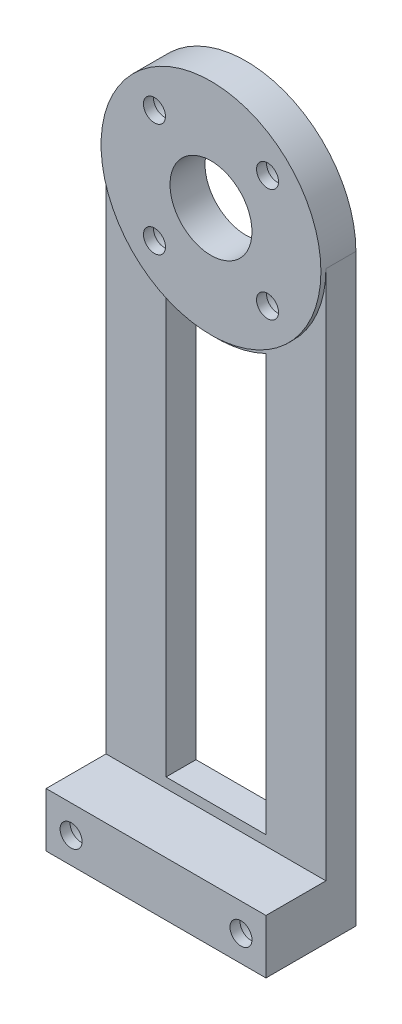
ISO-10303-21;
HEADER;
FILE_DESCRIPTION(('STEP AP214'),'2;1');
FILE_NAME('part.step','',(''),(''),'','','');
FILE_SCHEMA(('AUTOMOTIVE_DESIGN { 1 0 10303 214 1 1 1 1 }'));
ENDSEC;
DATA;
#1=APPLICATION_CONTEXT('core data for automotive mechanical design processes');
#2=APPLICATION_PROTOCOL_DEFINITION('international standard','automotive_design',2000,#1);
#3=PRODUCT_CONTEXT('',#1,'mechanical');
#4=PRODUCT('Part','Part','',(#3));
#5=PRODUCT_RELATED_PRODUCT_CATEGORY('part','',(#4));
#6=PRODUCT_DEFINITION_FORMATION('','',#4);
#7=PRODUCT_DEFINITION_CONTEXT('part definition',#1,'design');
#8=PRODUCT_DEFINITION('design','',#6,#7);
#9=PRODUCT_DEFINITION_SHAPE('','',#8);
#10=(LENGTH_UNIT() NAMED_UNIT(*) SI_UNIT(.MILLI.,.METRE.));
#11=(NAMED_UNIT(*) PLANE_ANGLE_UNIT() SI_UNIT($,.RADIAN.));
#12=(NAMED_UNIT(*) SI_UNIT($,.STERADIAN.) SOLID_ANGLE_UNIT());
#13=UNCERTAINTY_MEASURE_WITH_UNIT(LENGTH_MEASURE(1.E-05),#10,'distance_accuracy_value','');
#14=(GEOMETRIC_REPRESENTATION_CONTEXT(3) GLOBAL_UNCERTAINTY_ASSIGNED_CONTEXT((#13)) GLOBAL_UNIT_ASSIGNED_CONTEXT((#10,
#11,#12)) REPRESENTATION_CONTEXT('',''));
#15=CARTESIAN_POINT('',(0.,0.,0.));
#16=DIRECTION('',(0.,0.,1.));
#17=DIRECTION('',(1.,0.,0.));
#18=AXIS2_PLACEMENT_3D('',#15,#16,#17);
#19=CARTESIAN_POINT('',(8.5,-26.62018786,9.11126983722081));
#20=DIRECTION('',(0.,0.,-1.));
#21=DIRECTION('',(1.,0.,0.));
#22=AXIS2_PLACEMENT_3D('',#19,#20,#21);
#23=CYLINDRICAL_SURFACE('',#22,1.1);
#24=CARTESIAN_POINT('',(8.5,-26.62018786,6.));
#25=DIRECTION('',(0.,0.,1.));
#26=DIRECTION('',(1.,0.,0.));
#27=AXIS2_PLACEMENT_3D('',#24,#25,#26);
#28=CIRCLE('',#27,1.1);
#29=CARTESIAN_POINT('',(9.6,-26.62018786,6.));
#30=VERTEX_POINT('',#29);
#31=EDGE_CURVE('E241',#30,#30,#28,.F.);
#32=ORIENTED_EDGE('',*,*,#31,.F.);
#33=EDGE_LOOP('',(#32));
#34=FACE_BOUND('',#33,.T.);
#35=CARTESIAN_POINT('',(8.5,-26.62018786,5.));
#36=DIRECTION('',(0.,0.,1.));
#37=DIRECTION('',(1.,0.,0.));
#38=AXIS2_PLACEMENT_3D('',#35,#36,#37);
#39=CIRCLE('',#38,1.1);
#40=CARTESIAN_POINT('',(9.6,-26.62018786,5.));
#41=VERTEX_POINT('',#40);
#42=EDGE_CURVE('E639',#41,#41,#39,.F.);
#43=ORIENTED_EDGE('',*,*,#42,.T.);
#44=EDGE_LOOP('',(#43));
#45=FACE_BOUND('',#44,.T.);
#46=ADVANCED_FACE('F67',(#34,#45),#23,.F.);
#47=CARTESIAN_POINT('',(-8.5,-26.62018786,9.11126983722081));
#48=DIRECTION('',(0.,0.,-1.));
#49=DIRECTION('',(1.,0.,0.));
#50=AXIS2_PLACEMENT_3D('',#47,#48,#49);
#51=CYLINDRICAL_SURFACE('',#50,1.1);
#52=CARTESIAN_POINT('',(-8.5,-26.62018786,6.));
#53=DIRECTION('',(0.,0.,1.));
#54=DIRECTION('',(1.,0.,0.));
#55=AXIS2_PLACEMENT_3D('',#52,#53,#54);
#56=CIRCLE('',#55,1.1);
#57=CARTESIAN_POINT('',(-7.4,-26.62018786,6.));
#58=VERTEX_POINT('',#57);
#59=EDGE_CURVE('E238',#58,#58,#56,.F.);
#60=ORIENTED_EDGE('',*,*,#59,.F.);
#61=EDGE_LOOP('',(#60));
#62=FACE_BOUND('',#61,.T.);
#63=CARTESIAN_POINT('',(-8.5,-26.62018786,5.));
#64=DIRECTION('',(0.,0.,1.));
#65=DIRECTION('',(1.,0.,0.));
#66=AXIS2_PLACEMENT_3D('',#63,#64,#65);
#67=CIRCLE('',#66,1.1);
#68=CARTESIAN_POINT('',(-7.4,-26.62018786,5.));
#69=VERTEX_POINT('',#68);
#70=EDGE_CURVE('E650',#69,#69,#67,.F.);
#71=ORIENTED_EDGE('',*,*,#70,.T.);
#72=EDGE_LOOP('',(#71));
#73=FACE_BOUND('',#72,.T.);
#74=ADVANCED_FACE('F326',(#62,#73),#51,.F.);
#75=CARTESIAN_POINT('',(-5.65685424949235,23.5781457505076,12.0965512114594));
#76=DIRECTION('',(0.,0.,-1.));
#77=DIRECTION('',(1.,0.,0.));
#78=AXIS2_PLACEMENT_3D('',#75,#76,#77);
#79=CYLINDRICAL_SURFACE('',#78,1.10000000000001);
#80=CARTESIAN_POINT('',(-5.65685424949235,23.5781457505076,0.5));
#81=DIRECTION('',(0.,0.,1.));
#82=DIRECTION('',(1.,0.,0.));
#83=AXIS2_PLACEMENT_3D('',#80,#81,#82);
#84=CIRCLE('',#83,1.10000000000001);
#85=CARTESIAN_POINT('',(-4.55685424949234,23.5781457505076,0.5));
#86=VERTEX_POINT('',#85);
#87=EDGE_CURVE('E276',#86,#86,#84,.F.);
#88=ORIENTED_EDGE('',*,*,#87,.F.);
#89=EDGE_LOOP('',(#88));
#90=FACE_BOUND('',#89,.T.);
#91=CARTESIAN_POINT('',(-5.65685424949235,23.5781457505076,-0.5));
#92=DIRECTION('',(0.,0.,1.));
#93=DIRECTION('',(1.,0.,0.));
#94=AXIS2_PLACEMENT_3D('',#91,#92,#93);
#95=CIRCLE('',#94,1.10000000000001);
#96=CARTESIAN_POINT('',(-4.55685424949234,23.5781457505076,-0.5));
#97=VERTEX_POINT('',#96);
#98=EDGE_CURVE('E263',#97,#97,#95,.F.);
#99=ORIENTED_EDGE('',*,*,#98,.T.);
#100=EDGE_LOOP('',(#99));
#101=FACE_BOUND('',#100,.T.);
#102=ADVANCED_FACE('F332',(#90,#101),#79,.F.);
#103=CARTESIAN_POINT('',(-5.65685424949244,34.8918542494923,12.0965512114594));
#104=DIRECTION('',(0.,0.,-1.));
#105=DIRECTION('',(1.,0.,0.));
#106=AXIS2_PLACEMENT_3D('',#103,#104,#105);
#107=CYLINDRICAL_SURFACE('',#106,1.10000000000001);
#108=CARTESIAN_POINT('',(-5.65685424949244,34.8918542494923,0.5));
#109=DIRECTION('',(0.,0.,1.));
#110=DIRECTION('',(1.,0.,0.));
#111=AXIS2_PLACEMENT_3D('',#108,#109,#110);
#112=CIRCLE('',#111,1.10000000000001);
#113=CARTESIAN_POINT('',(-4.55685424949243,34.8918542494923,0.5));
#114=VERTEX_POINT('',#113);
#115=EDGE_CURVE('E279',#114,#114,#112,.F.);
#116=ORIENTED_EDGE('',*,*,#115,.F.);
#117=EDGE_LOOP('',(#116));
#118=FACE_BOUND('',#117,.T.);
#119=CARTESIAN_POINT('',(-5.65685424949244,34.8918542494923,-0.5));
#120=DIRECTION('',(0.,0.,1.));
#121=DIRECTION('',(1.,0.,0.));
#122=AXIS2_PLACEMENT_3D('',#119,#120,#121);
#123=CIRCLE('',#122,1.10000000000001);
#124=CARTESIAN_POINT('',(-4.55685424949243,34.8918542494923,-0.5));
#125=VERTEX_POINT('',#124);
#126=EDGE_CURVE('E253',#125,#125,#123,.F.);
#127=ORIENTED_EDGE('',*,*,#126,.T.);
#128=EDGE_LOOP('',(#127));
#129=FACE_BOUND('',#128,.T.);
#130=ADVANCED_FACE('F367',(#118,#129),#107,.F.);
#131=CARTESIAN_POINT('',(5.65685424949247,23.5781457505077,12.0965512114594));
#132=DIRECTION('',(0.,0.,-1.));
#133=DIRECTION('',(1.,0.,0.));
#134=AXIS2_PLACEMENT_3D('',#131,#132,#133);
#135=CYLINDRICAL_SURFACE('',#134,1.10000000000001);
#136=CARTESIAN_POINT('',(5.65685424949247,23.5781457505077,0.5));
#137=DIRECTION('',(0.,0.,1.));
#138=DIRECTION('',(1.,0.,0.));
#139=AXIS2_PLACEMENT_3D('',#136,#137,#138);
#140=CIRCLE('',#139,1.10000000000001);
#141=CARTESIAN_POINT('',(6.75685424949248,23.5781457505077,0.5));
#142=VERTEX_POINT('',#141);
#143=EDGE_CURVE('E259',#142,#142,#140,.F.);
#144=ORIENTED_EDGE('',*,*,#143,.F.);
#145=EDGE_LOOP('',(#144));
#146=FACE_BOUND('',#145,.T.);
#147=CARTESIAN_POINT('',(5.65685424949247,23.5781457505077,-0.5));
#148=DIRECTION('',(0.,0.,1.));
#149=DIRECTION('',(1.,0.,0.));
#150=AXIS2_PLACEMENT_3D('',#147,#148,#149);
#151=CIRCLE('',#150,1.10000000000001);
#152=CARTESIAN_POINT('',(6.75685424949248,23.5781457505077,-0.5));
#153=VERTEX_POINT('',#152);
#154=EDGE_CURVE('E247',#153,#153,#151,.F.);
#155=ORIENTED_EDGE('',*,*,#154,.T.);
#156=EDGE_LOOP('',(#155));
#157=FACE_BOUND('',#156,.T.);
#158=ADVANCED_FACE('F304',(#146,#157),#135,.F.);
#159=CARTESIAN_POINT('',(5.65685424949235,34.8918542494924,12.0965512114594));
#160=DIRECTION('',(0.,0.,-1.));
#161=DIRECTION('',(1.,0.,0.));
#162=AXIS2_PLACEMENT_3D('',#159,#160,#161);
#163=CYLINDRICAL_SURFACE('',#162,1.10000000000001);
#164=CARTESIAN_POINT('',(5.65685424949235,34.8918542494924,0.5));
#165=DIRECTION('',(0.,0.,1.));
#166=DIRECTION('',(1.,0.,0.));
#167=AXIS2_PLACEMENT_3D('',#164,#165,#166);
#168=CIRCLE('',#167,1.10000000000001);
#169=CARTESIAN_POINT('',(6.75685424949236,34.8918542494924,0.5));
#170=VERTEX_POINT('',#169);
#171=EDGE_CURVE('E182',#170,#170,#168,.F.);
#172=ORIENTED_EDGE('',*,*,#171,.F.);
#173=EDGE_LOOP('',(#172));
#174=FACE_BOUND('',#173,.T.);
#175=CARTESIAN_POINT('',(5.65685424949235,34.8918542494924,-0.5));
#176=DIRECTION('',(0.,0.,1.));
#177=DIRECTION('',(1.,0.,0.));
#178=AXIS2_PLACEMENT_3D('',#175,#176,#177);
#179=CIRCLE('',#178,1.10000000000001);
#180=CARTESIAN_POINT('',(6.75685424949236,34.8918542494924,-0.5));
#181=VERTEX_POINT('',#180);
#182=EDGE_CURVE('E282',#181,#181,#179,.F.);
#183=ORIENTED_EDGE('',*,*,#182,.T.);
#184=EDGE_LOOP('',(#183));
#185=FACE_BOUND('',#184,.T.);
#186=ADVANCED_FACE('F301',(#174,#185),#163,.F.);
#187=CARTESIAN_POINT('',(0.,0.,0.));
#188=DIRECTION('',(0.,0.,-1.));
#189=DIRECTION('',(1.,0.,0.));
#190=AXIS2_PLACEMENT_3D('',#187,#188,#189);
#191=PLANE('',#190);
#192=DIRECTION('',(0.,-1.,0.));
#193=VECTOR('',#192,1.);
#194=CARTESIAN_POINT('',(11.,0.,0.));
#195=LINE('',#194,#193);
#196=CARTESIAN_POINT('',(11.,29.235,0.));
#197=VERTEX_POINT('',#196);
#198=CARTESIAN_POINT('',(11.,-23.815,0.));
#199=VERTEX_POINT('',#198);
#200=EDGE_CURVE('E169',#197,#199,#195,.T.);
#201=ORIENTED_EDGE('',*,*,#200,.F.);
#202=CARTESIAN_POINT('',(0.,29.235,0.));
#203=DIRECTION('',(0.,0.,1.));
#204=DIRECTION('',(1.,0.,0.));
#205=AXIS2_PLACEMENT_3D('',#202,#203,#204);
#206=CIRCLE('',#205,11.);
#207=CARTESIAN_POINT('',(-11.,29.235,0.));
#208=VERTEX_POINT('',#207);
#209=EDGE_CURVE('E13',#208,#197,#206,.T.);
#210=ORIENTED_EDGE('',*,*,#209,.F.);
#211=DIRECTION('',(0.,-1.,0.));
#212=VECTOR('',#211,1.);
#213=CARTESIAN_POINT('',(-11.,0.,0.));
#214=LINE('',#213,#212);
#215=CARTESIAN_POINT('',(-11.,-23.815,0.));
#216=VERTEX_POINT('',#215);
#217=EDGE_CURVE('E171',#208,#216,#214,.T.);
#218=ORIENTED_EDGE('',*,*,#217,.T.);
#219=DIRECTION('',(-1.,0.,0.));
#220=VECTOR('',#219,1.);
#221=CARTESIAN_POINT('',(0.,-23.815,0.));
#222=LINE('',#221,#220);
#223=EDGE_CURVE('E164',#199,#216,#222,.T.);
#224=ORIENTED_EDGE('',*,*,#223,.F.);
#225=EDGE_LOOP('',(#201,#210,#218,#224));
#226=FACE_BOUND('',#225,.T.);
#227=CARTESIAN_POINT('',(0.,29.235,0.));
#228=DIRECTION('',(0.,0.,1.));
#229=DIRECTION('',(1.,0.,0.));
#230=AXIS2_PLACEMENT_3D('',#227,#228,#229);
#231=CIRCLE('',#230,11.5);
#232=CARTESIAN_POINT('',(-5.,18.878842411396,0.));
#233=VERTEX_POINT('',#232);
#234=CARTESIAN_POINT('',(4.99999999999999,18.878842411396,0.));
#235=VERTEX_POINT('',#234);
#236=EDGE_CURVE('E207',#233,#235,#231,.T.);
#237=ORIENTED_EDGE('',*,*,#236,.T.);
#238=DIRECTION('',(0.,-1.,0.));
#239=VECTOR('',#238,1.);
#240=CARTESIAN_POINT('',(5.,0.,0.));
#241=LINE('',#240,#239);
#242=CARTESIAN_POINT('',(5.00000000000002,-22.815,0.));
#243=VERTEX_POINT('',#242);
#244=EDGE_CURVE('E210',#235,#243,#241,.T.);
#245=ORIENTED_EDGE('',*,*,#244,.T.);
#246=DIRECTION('',(1.,0.,0.));
#247=VECTOR('',#246,1.);
#248=CARTESIAN_POINT('',(0.,-22.815,0.));
#249=LINE('',#248,#247);
#250=CARTESIAN_POINT('',(-4.99999999999998,-22.815,0.));
#251=VERTEX_POINT('',#250);
#252=EDGE_CURVE('E213',#251,#243,#249,.T.);
#253=ORIENTED_EDGE('',*,*,#252,.F.);
#254=DIRECTION('',(0.,-1.,0.));
#255=VECTOR('',#254,1.);
#256=CARTESIAN_POINT('',(-4.99999999999999,0.,0.));
#257=LINE('',#256,#255);
#258=EDGE_CURVE('E187',#233,#251,#257,.T.);
#259=ORIENTED_EDGE('',*,*,#258,.F.);
#260=EDGE_LOOP('',(#237,#245,#253,#259));
#261=FACE_BOUND('',#260,.T.);
#262=ADVANCED_FACE('F236',(#226,#261),#191,.F.);
#263=CARTESIAN_POINT('',(0.,-29.235,-3.));
#264=DIRECTION('',(0.,1.,0.));
#265=DIRECTION('',(0.,0.,-1.));
#266=AXIS2_PLACEMENT_3D('',#263,#264,#265);
#267=PLANE('',#266);
#268=DIRECTION('',(0.,0.,1.));
#269=VECTOR('',#268,1.);
#270=CARTESIAN_POINT('',(-11.,-29.235,-3.));
#271=LINE('',#270,#269);
#272=CARTESIAN_POINT('',(-11.,-29.235,-3.));
#273=VERTEX_POINT('',#272);
#274=CARTESIAN_POINT('',(-11.,-29.235,6.));
#275=VERTEX_POINT('',#274);
#276=EDGE_CURVE('E203',#273,#275,#271,.T.);
#277=ORIENTED_EDGE('',*,*,#276,.F.);
#278=DIRECTION('',(1.,0.,0.));
#279=VECTOR('',#278,1.);
#280=CARTESIAN_POINT('',(0.,-29.235,-3.));
#281=LINE('',#280,#279);
#282=CARTESIAN_POINT('',(11.,-29.235,-3.));
#283=VERTEX_POINT('',#282);
#284=EDGE_CURVE('E168',#273,#283,#281,.T.);
#285=ORIENTED_EDGE('',*,*,#284,.T.);
#286=DIRECTION('',(0.,0.,1.));
#287=VECTOR('',#286,1.);
#288=CARTESIAN_POINT('',(11.,-29.235,-3.));
#289=LINE('',#288,#287);
#290=CARTESIAN_POINT('',(11.,-29.235,6.));
#291=VERTEX_POINT('',#290);
#292=EDGE_CURVE('E71',#283,#291,#289,.T.);
#293=ORIENTED_EDGE('',*,*,#292,.T.);
#294=DIRECTION('',(1.,0.,0.));
#295=VECTOR('',#294,1.);
#296=CARTESIAN_POINT('',(0.,-29.235,6.));
#297=LINE('',#296,#295);
#298=EDGE_CURVE('E156',#275,#291,#297,.T.);
#299=ORIENTED_EDGE('',*,*,#298,.F.);
#300=EDGE_LOOP('',(#277,#285,#293,#299));
#301=FACE_BOUND('',#300,.T.);
#302=ADVANCED_FACE('F166',(#301),#267,.F.);
#303=CARTESIAN_POINT('',(-11.,0.,-3.));
#304=DIRECTION('',(1.,0.,0.));
#305=DIRECTION('',(0.,1.,0.));
#306=AXIS2_PLACEMENT_3D('',#303,#304,#305);
#307=PLANE('',#306);
#308=ORIENTED_EDGE('',*,*,#276,.T.);
#309=DIRECTION('',(0.,-1.,0.));
#310=VECTOR('',#309,1.);
#311=CARTESIAN_POINT('',(-11.,0.,6.));
#312=LINE('',#311,#310);
#313=CARTESIAN_POINT('',(-11.,-23.815,6.));
#314=VERTEX_POINT('',#313);
#315=EDGE_CURVE('E160',#314,#275,#312,.T.);
#316=ORIENTED_EDGE('',*,*,#315,.F.);
#317=DIRECTION('',(0.,0.,-1.));
#318=VECTOR('',#317,1.);
#319=CARTESIAN_POINT('',(-11.,-23.815,6.));
#320=LINE('',#319,#318);
#321=EDGE_CURVE('E84',#314,#216,#320,.T.);
#322=ORIENTED_EDGE('',*,*,#321,.T.);
#323=ORIENTED_EDGE('',*,*,#217,.F.);
#324=DIRECTION('',(0.,0.,1.));
#325=VECTOR('',#324,1.);
#326=CARTESIAN_POINT('',(-11.,29.235,-3.));
#327=LINE('',#326,#325);
#328=CARTESIAN_POINT('',(-11.,29.235,-3.));
#329=VERTEX_POINT('',#328);
#330=EDGE_CURVE('E227',#329,#208,#327,.T.);
#331=ORIENTED_EDGE('',*,*,#330,.F.);
#332=DIRECTION('',(0.,-1.,0.));
#333=VECTOR('',#332,1.);
#334=CARTESIAN_POINT('',(-11.,0.,-3.));
#335=LINE('',#334,#333);
#336=EDGE_CURVE('E189',#329,#273,#335,.T.);
#337=ORIENTED_EDGE('',*,*,#336,.T.);
#338=EDGE_LOOP('',(#308,#316,#322,#323,#331,#337));
#339=FACE_BOUND('',#338,.T.);
#340=ADVANCED_FACE('F399',(#339),#307,.F.);
#341=CARTESIAN_POINT('',(0.,0.,-3.));
#342=DIRECTION('',(0.,0.,-1.));
#343=DIRECTION('',(1.,0.,0.));
#344=AXIS2_PLACEMENT_3D('',#341,#342,#343);
#345=PLANE('',#344);
#346=CARTESIAN_POINT('',(-8.5,-26.62018786,-3.));
#347=DIRECTION('',(0.,0.,1.));
#348=DIRECTION('',(1.,0.,0.));
#349=AXIS2_PLACEMENT_3D('',#346,#347,#348);
#350=CIRCLE('',#349,2.);
#351=CARTESIAN_POINT('',(-6.5,-26.62018786,-3.));
#352=VERTEX_POINT('',#351);
#353=EDGE_CURVE('E640',#352,#352,#350,.T.);
#354=ORIENTED_EDGE('',*,*,#353,.T.);
#355=EDGE_LOOP('',(#354));
#356=FACE_BOUND('',#355,.T.);
#357=CARTESIAN_POINT('',(8.5,-26.62018786,-3.));
#358=DIRECTION('',(0.,0.,1.));
#359=DIRECTION('',(1.,0.,0.));
#360=AXIS2_PLACEMENT_3D('',#357,#358,#359);
#361=CIRCLE('',#360,2.);
#362=CARTESIAN_POINT('',(10.5,-26.62018786,-3.));
#363=VERTEX_POINT('',#362);
#364=EDGE_CURVE('E645',#363,#363,#361,.T.);
#365=ORIENTED_EDGE('',*,*,#364,.T.);
#366=EDGE_LOOP('',(#365));
#367=FACE_BOUND('',#366,.T.);
#368=CARTESIAN_POINT('',(-5.65685424949244,34.8918542494923,-3.));
#369=DIRECTION('',(0.,0.,1.));
#370=DIRECTION('',(0.,1.,0.));
#371=AXIS2_PLACEMENT_3D('',#368,#369,#370);
#372=CIRCLE('',#371,2.00000000000001);
#373=CARTESIAN_POINT('',(-5.65685424949244,36.8918542494923,-3.));
#374=VERTEX_POINT('',#373);
#375=EDGE_CURVE('E249',#374,#374,#372,.T.);
#376=ORIENTED_EDGE('',*,*,#375,.T.);
#377=EDGE_LOOP('',(#376));
#378=FACE_BOUND('',#377,.T.);
#379=CARTESIAN_POINT('',(-5.65685424949235,23.5781457505076,-3.));
#380=DIRECTION('',(0.,0.,1.));
#381=DIRECTION('',(-1.,0.,0.));
#382=AXIS2_PLACEMENT_3D('',#379,#380,#381);
#383=CIRCLE('',#382,2.00000000000001);
#384=CARTESIAN_POINT('',(-7.65685424949236,23.5781457505076,-3.));
#385=VERTEX_POINT('',#384);
#386=EDGE_CURVE('E260',#385,#385,#383,.T.);
#387=ORIENTED_EDGE('',*,*,#386,.T.);
#388=EDGE_LOOP('',(#387));
#389=FACE_BOUND('',#388,.T.);
#390=CARTESIAN_POINT('',(5.65685424949247,23.5781457505077,-3.));
#391=DIRECTION('',(0.,0.,1.));
#392=DIRECTION('',(0.,-1.,0.));
#393=AXIS2_PLACEMENT_3D('',#390,#391,#392);
#394=CIRCLE('',#393,2.00000000000001);
#395=CARTESIAN_POINT('',(5.65685424949249,21.5781457505077,-3.));
#396=VERTEX_POINT('',#395);
#397=EDGE_CURVE('E269',#396,#396,#394,.T.);
#398=ORIENTED_EDGE('',*,*,#397,.T.);
#399=EDGE_LOOP('',(#398));
#400=FACE_BOUND('',#399,.T.);
#401=CARTESIAN_POINT('',(5.65685424949235,34.8918542494924,-3.));
#402=DIRECTION('',(0.,0.,1.));
#403=DIRECTION('',(1.,0.,0.));
#404=AXIS2_PLACEMENT_3D('',#401,#402,#403);
#405=CIRCLE('',#404,2.00000000000001);
#406=CARTESIAN_POINT('',(7.65685424949235,34.8918542494924,-3.));
#407=VERTEX_POINT('',#406);
#408=EDGE_CURVE('E285',#407,#407,#405,.T.);
#409=ORIENTED_EDGE('',*,*,#408,.T.);
#410=EDGE_LOOP('',(#409));
#411=FACE_BOUND('',#410,.T.);
#412=CARTESIAN_POINT('',(0.,29.235,-3.));
#413=DIRECTION('',(0.,0.,1.));
#414=DIRECTION('',(1.,0.,0.));
#415=AXIS2_PLACEMENT_3D('',#412,#413,#414);
#416=CIRCLE('',#415,4.1);
#417=CARTESIAN_POINT('',(4.1,29.235,-3.));
#418=VERTEX_POINT('',#417);
#419=EDGE_CURVE('E179',#418,#418,#416,.T.);
#420=ORIENTED_EDGE('',*,*,#419,.T.);
#421=EDGE_LOOP('',(#420));
#422=FACE_BOUND('',#421,.T.);
#423=ORIENTED_EDGE('',*,*,#284,.F.);
#424=ORIENTED_EDGE('',*,*,#336,.F.);
#425=CARTESIAN_POINT('',(0.,29.235,-3.));
#426=DIRECTION('',(0.,0.,1.));
#427=DIRECTION('',(1.,0.,0.));
#428=AXIS2_PLACEMENT_3D('',#425,#426,#427);
#429=CIRCLE('',#428,11.);
#430=CARTESIAN_POINT('',(11.,29.235,-3.));
#431=VERTEX_POINT('',#430);
#432=EDGE_CURVE('E186',#431,#329,#429,.T.);
#433=ORIENTED_EDGE('',*,*,#432,.F.);
#434=DIRECTION('',(0.,-1.,0.));
#435=VECTOR('',#434,1.);
#436=CARTESIAN_POINT('',(11.,0.,-3.));
#437=LINE('',#436,#435);
#438=EDGE_CURVE('E184',#431,#283,#437,.T.);
#439=ORIENTED_EDGE('',*,*,#438,.T.);
#440=EDGE_LOOP('',(#423,#424,#433,#439));
#441=FACE_BOUND('',#440,.T.);
#442=CARTESIAN_POINT('',(0.,29.235,-3.));
#443=DIRECTION('',(0.,0.,1.));
#444=DIRECTION('',(1.,0.,0.));
#445=AXIS2_PLACEMENT_3D('',#442,#443,#444);
#446=CIRCLE('',#445,11.5);
#447=CARTESIAN_POINT('',(-5.,18.878842411396,-3.));
#448=VERTEX_POINT('',#447);
#449=CARTESIAN_POINT('',(4.99999999999999,18.878842411396,-3.));
#450=VERTEX_POINT('',#449);
#451=EDGE_CURVE('E192',#448,#450,#446,.T.);
#452=ORIENTED_EDGE('',*,*,#451,.F.);
#453=DIRECTION('',(0.,-1.,0.));
#454=VECTOR('',#453,1.);
#455=CARTESIAN_POINT('',(-4.99999999999999,0.,-3.));
#456=LINE('',#455,#454);
#457=CARTESIAN_POINT('',(-4.99999999999998,-22.815,-3.));
#458=VERTEX_POINT('',#457);
#459=EDGE_CURVE('E201',#448,#458,#456,.T.);
#460=ORIENTED_EDGE('',*,*,#459,.T.);
#461=DIRECTION('',(1.,0.,0.));
#462=VECTOR('',#461,1.);
#463=CARTESIAN_POINT('',(0.,-22.815,-3.));
#464=LINE('',#463,#462);
#465=CARTESIAN_POINT('',(5.00000000000002,-22.815,-3.));
#466=VERTEX_POINT('',#465);
#467=EDGE_CURVE('E198',#458,#466,#464,.T.);
#468=ORIENTED_EDGE('',*,*,#467,.T.);
#469=DIRECTION('',(0.,-1.,0.));
#470=VECTOR('',#469,1.);
#471=CARTESIAN_POINT('',(5.,0.,-3.));
#472=LINE('',#471,#470);
#473=EDGE_CURVE('E195',#450,#466,#472,.T.);
#474=ORIENTED_EDGE('',*,*,#473,.F.);
#475=EDGE_LOOP('',(#452,#460,#468,#474));
#476=FACE_BOUND('',#475,.T.);
#477=ADVANCED_FACE('F396',(#356,#367,#378,#389,#400,#411,#422,#441,#476),#345,.T.);
#478=CARTESIAN_POINT('',(11.,0.,-3.));
#479=DIRECTION('',(1.,0.,0.));
#480=DIRECTION('',(0.,1.,0.));
#481=AXIS2_PLACEMENT_3D('',#478,#479,#480);
#482=PLANE('',#481);
#483=ORIENTED_EDGE('',*,*,#200,.T.);
#484=DIRECTION('',(0.,0.,-1.));
#485=VECTOR('',#484,1.);
#486=CARTESIAN_POINT('',(11.,-23.815,6.));
#487=LINE('',#486,#485);
#488=CARTESIAN_POINT('',(11.,-23.815,6.));
#489=VERTEX_POINT('',#488);
#490=EDGE_CURVE('E91',#489,#199,#487,.T.);
#491=ORIENTED_EDGE('',*,*,#490,.F.);
#492=DIRECTION('',(0.,-1.,0.));
#493=VECTOR('',#492,1.);
#494=CARTESIAN_POINT('',(11.,0.,6.));
#495=LINE('',#494,#493);
#496=EDGE_CURVE('E148',#489,#291,#495,.T.);
#497=ORIENTED_EDGE('',*,*,#496,.T.);
#498=ORIENTED_EDGE('',*,*,#292,.F.);
#499=ORIENTED_EDGE('',*,*,#438,.F.);
#500=DIRECTION('',(0.,0.,1.));
#501=VECTOR('',#500,1.);
#502=CARTESIAN_POINT('',(11.,29.235,-3.));
#503=LINE('',#502,#501);
#504=EDGE_CURVE('E221',#431,#197,#503,.T.);
#505=ORIENTED_EDGE('',*,*,#504,.T.);
#506=EDGE_LOOP('',(#483,#491,#497,#498,#499,#505));
#507=FACE_BOUND('',#506,.T.);
#508=ADVANCED_FACE('F69',(#507),#482,.T.);
#509=CARTESIAN_POINT('',(0.,29.235,-3.));
#510=DIRECTION('',(0.,0.,1.));
#511=DIRECTION('',(-1.,0.,0.));
#512=AXIS2_PLACEMENT_3D('',#509,#510,#511);
#513=CYLINDRICAL_SURFACE('',#512,11.);
#514=ORIENTED_EDGE('',*,*,#504,.F.);
#515=ORIENTED_EDGE('',*,*,#432,.T.);
#516=ORIENTED_EDGE('',*,*,#330,.T.);
#517=ORIENTED_EDGE('',*,*,#209,.T.);
#518=EDGE_LOOP('',(#514,#515,#516,#517));
#519=FACE_BOUND('',#518,.T.);
#520=CARTESIAN_POINT('',(0.,29.235,0.5));
#521=DIRECTION('',(0.,0.,1.));
#522=DIRECTION('',(1.,0.,0.));
#523=AXIS2_PLACEMENT_3D('',#520,#521,#522);
#524=CIRCLE('',#523,11.);
#525=CARTESIAN_POINT('',(11.,29.235,0.5));
#526=VERTEX_POINT('',#525);
#527=EDGE_CURVE('E170',#526,#526,#524,.T.);
#528=ORIENTED_EDGE('',*,*,#527,.F.);
#529=EDGE_LOOP('',(#528));
#530=FACE_BOUND('',#529,.T.);
#531=ADVANCED_FACE('F232',(#519,#530),#513,.T.);
#532=CARTESIAN_POINT('',(5.,0.,-3.));
#533=DIRECTION('',(1.,0.,0.));
#534=DIRECTION('',(0.,1.,0.));
#535=AXIS2_PLACEMENT_3D('',#532,#533,#534);
#536=PLANE('',#535);
#537=ORIENTED_EDGE('',*,*,#244,.F.);
#538=DIRECTION('',(0.,0.,1.));
#539=VECTOR('',#538,1.);
#540=CARTESIAN_POINT('',(4.99999999999999,18.878842411396,-3.));
#541=LINE('',#540,#539);
#542=EDGE_CURVE('E76',#450,#235,#541,.T.);
#543=ORIENTED_EDGE('',*,*,#542,.F.);
#544=ORIENTED_EDGE('',*,*,#473,.T.);
#545=DIRECTION('',(0.,0.,1.));
#546=VECTOR('',#545,1.);
#547=CARTESIAN_POINT('',(5.00000000000002,-22.815,-3.));
#548=LINE('',#547,#546);
#549=EDGE_CURVE('E223',#466,#243,#548,.T.);
#550=ORIENTED_EDGE('',*,*,#549,.T.);
#551=EDGE_LOOP('',(#537,#543,#544,#550));
#552=FACE_BOUND('',#551,.T.);
#553=ADVANCED_FACE('F410',(#552),#536,.F.);
#554=CARTESIAN_POINT('',(0.,-22.815,-3.));
#555=DIRECTION('',(0.,1.,0.));
#556=DIRECTION('',(0.,0.,-1.));
#557=AXIS2_PLACEMENT_3D('',#554,#555,#556);
#558=PLANE('',#557);
#559=ORIENTED_EDGE('',*,*,#252,.T.);
#560=ORIENTED_EDGE('',*,*,#549,.F.);
#561=ORIENTED_EDGE('',*,*,#467,.F.);
#562=DIRECTION('',(0.,0.,1.));
#563=VECTOR('',#562,1.);
#564=CARTESIAN_POINT('',(-4.99999999999998,-22.815,-3.));
#565=LINE('',#564,#563);
#566=EDGE_CURVE('E220',#458,#251,#565,.T.);
#567=ORIENTED_EDGE('',*,*,#566,.T.);
#568=EDGE_LOOP('',(#559,#560,#561,#567));
#569=FACE_BOUND('',#568,.T.);
#570=ADVANCED_FACE('F406',(#569),#558,.T.);
#571=CARTESIAN_POINT('',(-4.99999999999999,0.,-3.));
#572=DIRECTION('',(1.,0.,0.));
#573=DIRECTION('',(0.,1.,0.));
#574=AXIS2_PLACEMENT_3D('',#571,#572,#573);
#575=PLANE('',#574);
#576=ORIENTED_EDGE('',*,*,#258,.T.);
#577=ORIENTED_EDGE('',*,*,#566,.F.);
#578=ORIENTED_EDGE('',*,*,#459,.F.);
#579=DIRECTION('',(0.,0.,1.));
#580=VECTOR('',#579,1.);
#581=CARTESIAN_POINT('',(-5.,18.878842411396,-3.));
#582=LINE('',#581,#580);
#583=EDGE_CURVE('E218',#448,#233,#582,.T.);
#584=ORIENTED_EDGE('',*,*,#583,.T.);
#585=EDGE_LOOP('',(#576,#577,#578,#584));
#586=FACE_BOUND('',#585,.T.);
#587=ADVANCED_FACE('F403',(#586),#575,.T.);
#588=CARTESIAN_POINT('',(0.,29.235,-3.));
#589=DIRECTION('',(0.,0.,1.));
#590=DIRECTION('',(-1.,0.,0.));
#591=AXIS2_PLACEMENT_3D('',#588,#589,#590);
#592=CYLINDRICAL_SURFACE('',#591,11.5);
#593=ORIENTED_EDGE('',*,*,#236,.F.);
#594=ORIENTED_EDGE('',*,*,#583,.F.);
#595=ORIENTED_EDGE('',*,*,#451,.T.);
#596=ORIENTED_EDGE('',*,*,#542,.T.);
#597=EDGE_LOOP('',(#593,#594,#595,#596));
#598=FACE_BOUND('',#597,.T.);
#599=ADVANCED_FACE('F383',(#598),#592,.T.);
#600=CARTESIAN_POINT('',(0.,0.,0.5));
#601=DIRECTION('',(0.,0.,-1.));
#602=DIRECTION('',(1.,0.,0.));
#603=AXIS2_PLACEMENT_3D('',#600,#601,#602);
#604=PLANE('',#603);
#605=ORIENTED_EDGE('',*,*,#143,.T.);
#606=EDGE_LOOP('',(#605));
#607=FACE_BOUND('',#606,.T.);
#608=ORIENTED_EDGE('',*,*,#115,.T.);
#609=EDGE_LOOP('',(#608));
#610=FACE_BOUND('',#609,.T.);
#611=ORIENTED_EDGE('',*,*,#87,.T.);
#612=EDGE_LOOP('',(#611));
#613=FACE_BOUND('',#612,.T.);
#614=CARTESIAN_POINT('',(0.,29.235,0.5));
#615=DIRECTION('',(0.,0.,1.));
#616=DIRECTION('',(1.,0.,0.));
#617=AXIS2_PLACEMENT_3D('',#614,#615,#616);
#618=CIRCLE('',#617,4.1);
#619=CARTESIAN_POINT('',(4.1,29.235,0.5));
#620=VERTEX_POINT('',#619);
#621=EDGE_CURVE('E174',#620,#620,#618,.F.);
#622=ORIENTED_EDGE('',*,*,#621,.T.);
#623=EDGE_LOOP('',(#622));
#624=FACE_BOUND('',#623,.T.);
#625=ORIENTED_EDGE('',*,*,#171,.T.);
#626=EDGE_LOOP('',(#625));
#627=FACE_BOUND('',#626,.T.);
#628=ORIENTED_EDGE('',*,*,#527,.T.);
#629=EDGE_LOOP('',(#628));
#630=FACE_BOUND('',#629,.T.);
#631=ADVANCED_FACE('F299',(#607,#610,#613,#624,#627,#630),#604,.F.);
#632=CARTESIAN_POINT('',(0.,29.235,12.0965512114594));
#633=DIRECTION('',(0.,0.,-1.));
#634=DIRECTION('',(1.,0.,0.));
#635=AXIS2_PLACEMENT_3D('',#632,#633,#634);
#636=CYLINDRICAL_SURFACE('',#635,4.1);
#637=ORIENTED_EDGE('',*,*,#621,.F.);
#638=EDGE_LOOP('',(#637));
#639=FACE_BOUND('',#638,.T.);
#640=ORIENTED_EDGE('',*,*,#419,.F.);
#641=EDGE_LOOP('',(#640));
#642=FACE_BOUND('',#641,.T.);
#643=ADVANCED_FACE('F321',(#639,#642),#636,.F.);
#644=CARTESIAN_POINT('',(5.65685424949235,34.8918542494924,6.1568542494924));
#645=DIRECTION('',(0.,0.,-1.));
#646=DIRECTION('',(1.,0.,0.));
#647=AXIS2_PLACEMENT_3D('',#644,#645,#646);
#648=CYLINDRICAL_SURFACE('',#647,2.00000000000001);
#649=CARTESIAN_POINT('',(5.65685424949235,34.8918542494924,-0.5));
#650=DIRECTION('',(0.,0.,1.));
#651=DIRECTION('',(1.,0.,0.));
#652=AXIS2_PLACEMENT_3D('',#649,#650,#651);
#653=CIRCLE('',#652,2.00000000000001);
#654=CARTESIAN_POINT('',(7.65685424949235,34.8918542494924,-0.5));
#655=VERTEX_POINT('',#654);
#656=EDGE_CURVE('E288',#655,#655,#653,.F.);
#657=ORIENTED_EDGE('',*,*,#656,.F.);
#658=EDGE_LOOP('',(#657));
#659=FACE_BOUND('',#658,.T.);
#660=ORIENTED_EDGE('',*,*,#408,.F.);
#661=EDGE_LOOP('',(#660));
#662=FACE_BOUND('',#661,.T.);
#663=ADVANCED_FACE('F311',(#659,#662),#648,.F.);
#664=CARTESIAN_POINT('',(0.,0.,-0.5));
#665=DIRECTION('',(0.,0.,-1.));
#666=DIRECTION('',(1.,0.,0.));
#667=AXIS2_PLACEMENT_3D('',#664,#665,#666);
#668=PLANE('',#667);
#669=ORIENTED_EDGE('',*,*,#656,.T.);
#670=EDGE_LOOP('',(#669));
#671=FACE_BOUND('',#670,.T.);
#672=ORIENTED_EDGE('',*,*,#182,.F.);
#673=EDGE_LOOP('',(#672));
#674=FACE_BOUND('',#673,.T.);
#675=ADVANCED_FACE('F308',(#671,#674),#668,.T.);
#676=CARTESIAN_POINT('',(5.65685424949247,23.5781457505077,6.1568542494924));
#677=DIRECTION('',(0.,0.,-1.));
#678=DIRECTION('',(1.,0.,0.));
#679=AXIS2_PLACEMENT_3D('',#676,#677,#678);
#680=CYLINDRICAL_SURFACE('',#679,2.00000000000001);
#681=CARTESIAN_POINT('',(5.65685424949247,23.5781457505077,-0.5));
#682=DIRECTION('',(0.,0.,1.));
#683=DIRECTION('',(1.,0.,0.));
#684=AXIS2_PLACEMENT_3D('',#681,#682,#683);
#685=CIRCLE('',#684,2.00000000000001);
#686=CARTESIAN_POINT('',(7.65685424949248,23.5781457505077,-0.5));
#687=VERTEX_POINT('',#686);
#688=EDGE_CURVE('E266',#687,#687,#685,.F.);
#689=ORIENTED_EDGE('',*,*,#688,.F.);
#690=EDGE_LOOP('',(#689));
#691=FACE_BOUND('',#690,.T.);
#692=ORIENTED_EDGE('',*,*,#397,.F.);
#693=EDGE_LOOP('',(#692));
#694=FACE_BOUND('',#693,.T.);
#695=ADVANCED_FACE('F310',(#691,#694),#680,.F.);
#696=CARTESIAN_POINT('',(0.,0.,-0.5));
#697=DIRECTION('',(0.,0.,-1.));
#698=DIRECTION('',(1.,0.,0.));
#699=AXIS2_PLACEMENT_3D('',#696,#697,#698);
#700=PLANE('',#699);
#701=ORIENTED_EDGE('',*,*,#688,.T.);
#702=EDGE_LOOP('',(#701));
#703=FACE_BOUND('',#702,.T.);
#704=ORIENTED_EDGE('',*,*,#154,.F.);
#705=EDGE_LOOP('',(#704));
#706=FACE_BOUND('',#705,.T.);
#707=ADVANCED_FACE('F318',(#703,#706),#700,.T.);
#708=CARTESIAN_POINT('',(-5.65685424949244,34.8918542494923,6.1568542494924));
#709=DIRECTION('',(0.,0.,-1.));
#710=DIRECTION('',(1.,0.,0.));
#711=AXIS2_PLACEMENT_3D('',#708,#709,#710);
#712=CYLINDRICAL_SURFACE('',#711,2.00000000000001);
#713=CARTESIAN_POINT('',(-5.65685424949244,34.8918542494923,-0.5));
#714=DIRECTION('',(0.,0.,1.));
#715=DIRECTION('',(1.,0.,0.));
#716=AXIS2_PLACEMENT_3D('',#713,#714,#715);
#717=CIRCLE('',#716,2.00000000000001);
#718=CARTESIAN_POINT('',(-3.65685424949243,34.8918542494923,-0.5));
#719=VERTEX_POINT('',#718);
#720=EDGE_CURVE('E252',#719,#719,#717,.F.);
#721=ORIENTED_EDGE('',*,*,#720,.F.);
#722=EDGE_LOOP('',(#721));
#723=FACE_BOUND('',#722,.T.);
#724=ORIENTED_EDGE('',*,*,#375,.F.);
#725=EDGE_LOOP('',(#724));
#726=FACE_BOUND('',#725,.T.);
#727=ADVANCED_FACE('F347',(#723,#726),#712,.F.);
#728=CARTESIAN_POINT('',(0.,0.,-0.5));
#729=DIRECTION('',(0.,0.,-1.));
#730=DIRECTION('',(1.,0.,0.));
#731=AXIS2_PLACEMENT_3D('',#728,#729,#730);
#732=PLANE('',#731);
#733=ORIENTED_EDGE('',*,*,#720,.T.);
#734=EDGE_LOOP('',(#733));
#735=FACE_BOUND('',#734,.T.);
#736=ORIENTED_EDGE('',*,*,#126,.F.);
#737=EDGE_LOOP('',(#736));
#738=FACE_BOUND('',#737,.T.);
#739=ADVANCED_FACE('F350',(#735,#738),#732,.T.);
#740=CARTESIAN_POINT('',(-5.65685424949235,23.5781457505076,6.1568542494924));
#741=DIRECTION('',(0.,0.,-1.));
#742=DIRECTION('',(1.,0.,0.));
#743=AXIS2_PLACEMENT_3D('',#740,#741,#742);
#744=CYLINDRICAL_SURFACE('',#743,2.00000000000001);
#745=CARTESIAN_POINT('',(-5.65685424949235,23.5781457505076,-0.5));
#746=DIRECTION('',(0.,0.,1.));
#747=DIRECTION('',(1.,0.,0.));
#748=AXIS2_PLACEMENT_3D('',#745,#746,#747);
#749=CIRCLE('',#748,2.00000000000001);
#750=CARTESIAN_POINT('',(-3.65685424949235,23.5781457505076,-0.5));
#751=VERTEX_POINT('',#750);
#752=EDGE_CURVE('E256',#751,#751,#749,.F.);
#753=ORIENTED_EDGE('',*,*,#752,.F.);
#754=EDGE_LOOP('',(#753));
#755=FACE_BOUND('',#754,.T.);
#756=ORIENTED_EDGE('',*,*,#386,.F.);
#757=EDGE_LOOP('',(#756));
#758=FACE_BOUND('',#757,.T.);
#759=ADVANCED_FACE('F354',(#755,#758),#744,.F.);
#760=CARTESIAN_POINT('',(0.,0.,-0.5));
#761=DIRECTION('',(0.,0.,-1.));
#762=DIRECTION('',(1.,0.,0.));
#763=AXIS2_PLACEMENT_3D('',#760,#761,#762);
#764=PLANE('',#763);
#765=ORIENTED_EDGE('',*,*,#752,.T.);
#766=EDGE_LOOP('',(#765));
#767=FACE_BOUND('',#766,.T.);
#768=ORIENTED_EDGE('',*,*,#98,.F.);
#769=EDGE_LOOP('',(#768));
#770=FACE_BOUND('',#769,.T.);
#771=ADVANCED_FACE('F346',(#767,#770),#764,.T.);
#772=CARTESIAN_POINT('',(0.,-23.815,6.));
#773=DIRECTION('',(0.,1.,0.));
#774=DIRECTION('',(0.,0.,-1.));
#775=AXIS2_PLACEMENT_3D('',#772,#773,#774);
#776=PLANE('',#775);
#777=ORIENTED_EDGE('',*,*,#223,.T.);
#778=ORIENTED_EDGE('',*,*,#321,.F.);
#779=DIRECTION('',(-1.,0.,0.));
#780=VECTOR('',#779,1.);
#781=CARTESIAN_POINT('',(0.,-23.815,6.));
#782=LINE('',#781,#780);
#783=EDGE_CURVE('E155',#489,#314,#782,.T.);
#784=ORIENTED_EDGE('',*,*,#783,.F.);
#785=ORIENTED_EDGE('',*,*,#490,.T.);
#786=EDGE_LOOP('',(#777,#778,#784,#785));
#787=FACE_BOUND('',#786,.T.);
#788=ADVANCED_FACE('F342',(#787),#776,.T.);
#789=CARTESIAN_POINT('',(0.,0.,6.));
#790=DIRECTION('',(0.,0.,-1.));
#791=DIRECTION('',(1.,0.,0.));
#792=AXIS2_PLACEMENT_3D('',#789,#790,#791);
#793=PLANE('',#792);
#794=ORIENTED_EDGE('',*,*,#59,.T.);
#795=EDGE_LOOP('',(#794));
#796=FACE_BOUND('',#795,.T.);
#797=ORIENTED_EDGE('',*,*,#31,.T.);
#798=EDGE_LOOP('',(#797));
#799=FACE_BOUND('',#798,.T.);
#800=ORIENTED_EDGE('',*,*,#298,.T.);
#801=ORIENTED_EDGE('',*,*,#496,.F.);
#802=ORIENTED_EDGE('',*,*,#783,.T.);
#803=ORIENTED_EDGE('',*,*,#315,.T.);
#804=EDGE_LOOP('',(#800,#801,#802,#803));
#805=FACE_BOUND('',#804,.T.);
#806=ADVANCED_FACE('F159',(#796,#799,#805),#793,.F.);
#807=CARTESIAN_POINT('',(-8.5,-26.62018786,11.6568542494924));
#808=DIRECTION('',(0.,0.,-1.));
#809=DIRECTION('',(1.,0.,0.));
#810=AXIS2_PLACEMENT_3D('',#807,#808,#809);
#811=CYLINDRICAL_SURFACE('',#810,2.);
#812=CARTESIAN_POINT('',(-8.5,-26.62018786,5.));
#813=DIRECTION('',(0.,0.,1.));
#814=DIRECTION('',(1.,0.,0.));
#815=AXIS2_PLACEMENT_3D('',#812,#813,#814);
#816=CIRCLE('',#815,2.);
#817=CARTESIAN_POINT('',(-6.5,-26.62018786,5.));
#818=VERTEX_POINT('',#817);
#819=EDGE_CURVE('E643',#818,#818,#816,.F.);
#820=ORIENTED_EDGE('',*,*,#819,.F.);
#821=EDGE_LOOP('',(#820));
#822=FACE_BOUND('',#821,.T.);
#823=ORIENTED_EDGE('',*,*,#353,.F.);
#824=EDGE_LOOP('',(#823));
#825=FACE_BOUND('',#824,.T.);
#826=ADVANCED_FACE('F341',(#822,#825),#811,.F.);
#827=CARTESIAN_POINT('',(0.,0.,5.));
#828=DIRECTION('',(0.,0.,-1.));
#829=DIRECTION('',(1.,0.,0.));
#830=AXIS2_PLACEMENT_3D('',#827,#828,#829);
#831=PLANE('',#830);
#832=ORIENTED_EDGE('',*,*,#819,.T.);
#833=EDGE_LOOP('',(#832));
#834=FACE_BOUND('',#833,.T.);
#835=ORIENTED_EDGE('',*,*,#70,.F.);
#836=EDGE_LOOP('',(#835));
#837=FACE_BOUND('',#836,.T.);
#838=ADVANCED_FACE('F599',(#834,#837),#831,.T.);
#839=CARTESIAN_POINT('',(8.5,-26.62018786,11.6568542494924));
#840=DIRECTION('',(0.,0.,-1.));
#841=DIRECTION('',(1.,0.,0.));
#842=AXIS2_PLACEMENT_3D('',#839,#840,#841);
#843=CYLINDRICAL_SURFACE('',#842,2.);
#844=CARTESIAN_POINT('',(8.5,-26.62018786,5.));
#845=DIRECTION('',(0.,0.,1.));
#846=DIRECTION('',(1.,0.,0.));
#847=AXIS2_PLACEMENT_3D('',#844,#845,#846);
#848=CIRCLE('',#847,2.);
#849=CARTESIAN_POINT('',(10.5,-26.62018786,5.));
#850=VERTEX_POINT('',#849);
#851=EDGE_CURVE('E636',#850,#850,#848,.F.);
#852=ORIENTED_EDGE('',*,*,#851,.F.);
#853=EDGE_LOOP('',(#852));
#854=FACE_BOUND('',#853,.T.);
#855=ORIENTED_EDGE('',*,*,#364,.F.);
#856=EDGE_LOOP('',(#855));
#857=FACE_BOUND('',#856,.T.);
#858=ADVANCED_FACE('F610',(#854,#857),#843,.F.);
#859=CARTESIAN_POINT('',(0.,0.,5.));
#860=DIRECTION('',(0.,0.,-1.));
#861=DIRECTION('',(1.,0.,0.));
#862=AXIS2_PLACEMENT_3D('',#859,#860,#861);
#863=PLANE('',#862);
#864=ORIENTED_EDGE('',*,*,#851,.T.);
#865=EDGE_LOOP('',(#864));
#866=FACE_BOUND('',#865,.T.);
#867=ORIENTED_EDGE('',*,*,#42,.F.);
#868=EDGE_LOOP('',(#867));
#869=FACE_BOUND('',#868,.T.);
#870=ADVANCED_FACE('F620',(#866,#869),#863,.T.);
#871=CLOSED_SHELL('',(#46,#74,#102,#130,#158,#186,#262,#302,#340,#477,#508,#531,#553,#570,#587,
#599,#631,#643,#663,#675,#695,#707,#727,#739,#759,#771,#788,#806,#826,#838,#858,#870));
#872=MANIFOLD_SOLID_BREP('B2',#871);
#873=ADVANCED_BREP_SHAPE_REPRESENTATION('',(#18,#872),#14);
#874=SHAPE_DEFINITION_REPRESENTATION(#9,#873);
ENDSEC;
END-ISO-10303-21;
